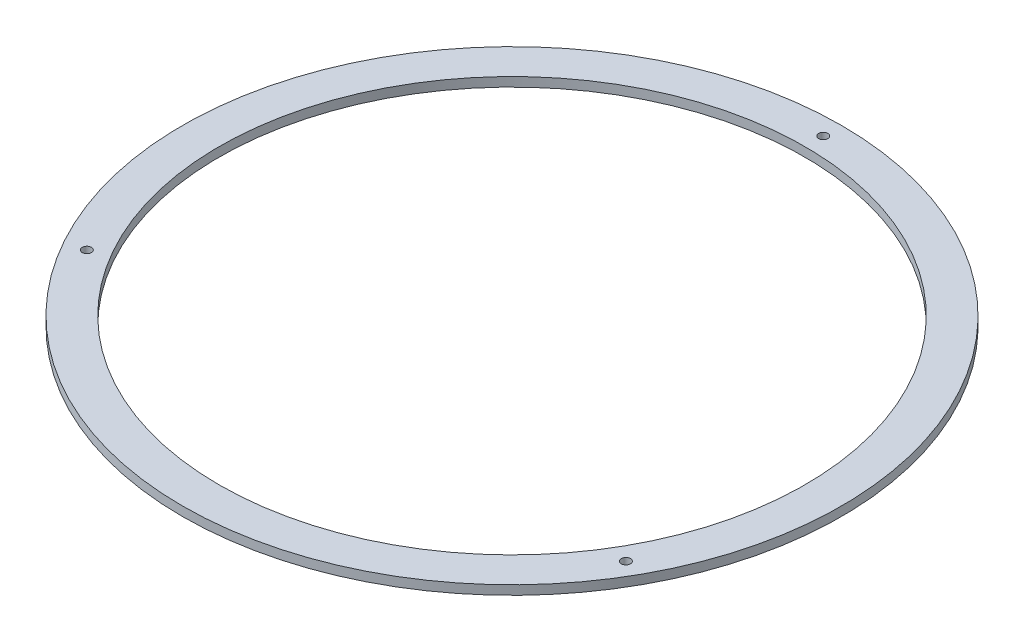
ISO-10303-21;
HEADER;
FILE_DESCRIPTION(('STEP AP214'),'2;1');
FILE_NAME('part.step','',(''),(''),'','','');
FILE_SCHEMA(('AUTOMOTIVE_DESIGN { 1 0 10303 214 1 1 1 1 }'));
ENDSEC;
DATA;
#1=APPLICATION_CONTEXT('core data for automotive mechanical design processes');
#2=APPLICATION_PROTOCOL_DEFINITION('international standard','automotive_design',2000,#1);
#3=PRODUCT_CONTEXT('',#1,'mechanical');
#4=PRODUCT('Part','Part','',(#3));
#5=PRODUCT_RELATED_PRODUCT_CATEGORY('part','',(#4));
#6=PRODUCT_DEFINITION_FORMATION('','',#4);
#7=PRODUCT_DEFINITION_CONTEXT('part definition',#1,'design');
#8=PRODUCT_DEFINITION('design','',#6,#7);
#9=PRODUCT_DEFINITION_SHAPE('','',#8);
#10=(LENGTH_UNIT() NAMED_UNIT(*) SI_UNIT(.MILLI.,.METRE.));
#11=(NAMED_UNIT(*) PLANE_ANGLE_UNIT() SI_UNIT($,.RADIAN.));
#12=(NAMED_UNIT(*) SI_UNIT($,.STERADIAN.) SOLID_ANGLE_UNIT());
#13=UNCERTAINTY_MEASURE_WITH_UNIT(LENGTH_MEASURE(1.E-05),#10,'distance_accuracy_value','');
#14=(GEOMETRIC_REPRESENTATION_CONTEXT(3) GLOBAL_UNCERTAINTY_ASSIGNED_CONTEXT((#13)) GLOBAL_UNIT_ASSIGNED_CONTEXT((#10,
#11,#12)) REPRESENTATION_CONTEXT('',''));
#15=CARTESIAN_POINT('',(0.,0.,0.));
#16=DIRECTION('',(0.,0.,1.));
#17=DIRECTION('',(1.,0.,0.));
#18=AXIS2_PLACEMENT_3D('',#15,#16,#17);
#19=CARTESIAN_POINT('',(0.,6.35,0.));
#20=DIRECTION('',(0.,-1.,0.));
#21=DIRECTION('',(0.,0.,-1.));
#22=AXIS2_PLACEMENT_3D('',#19,#20,#21);
#23=CYLINDRICAL_SURFACE('',#22,228.6);
#24=CARTESIAN_POINT('',(0.,6.35,0.));
#25=DIRECTION('',(0.,1.,0.));
#26=DIRECTION('',(0.,0.,1.));
#27=AXIS2_PLACEMENT_3D('',#24,#25,#26);
#28=CIRCLE('',#27,228.6);
#29=CARTESIAN_POINT('',(0.,6.35,228.6));
#30=VERTEX_POINT('',#29);
#31=EDGE_CURVE('E10',#30,#30,#28,.T.);
#32=ORIENTED_EDGE('',*,*,#31,.F.);
#33=EDGE_LOOP('',(#32));
#34=FACE_BOUND('',#33,.T.);
#35=CARTESIAN_POINT('',(0.,0.,0.));
#36=DIRECTION('',(0.,1.,0.));
#37=DIRECTION('',(0.,0.,1.));
#38=AXIS2_PLACEMENT_3D('',#35,#36,#37);
#39=CIRCLE('',#38,228.6);
#40=CARTESIAN_POINT('',(0.,0.,228.6));
#41=VERTEX_POINT('',#40);
#42=EDGE_CURVE('E40',#41,#41,#39,.T.);
#43=ORIENTED_EDGE('',*,*,#42,.T.);
#44=EDGE_LOOP('',(#43));
#45=FACE_BOUND('',#44,.T.);
#46=ADVANCED_FACE('F37',(#34,#45),#23,.T.);
#47=CARTESIAN_POINT('',(0.,6.35,0.));
#48=DIRECTION('',(0.,1.,0.));
#49=DIRECTION('',(0.,0.,1.));
#50=AXIS2_PLACEMENT_3D('',#47,#48,#49);
#51=PLANE('',#50);
#52=CARTESIAN_POINT('',(0.,6.35,0.));
#53=DIRECTION('',(0.,1.,0.));
#54=DIRECTION('',(0.,0.,1.));
#55=AXIS2_PLACEMENT_3D('',#52,#53,#54);
#56=CIRCLE('',#55,203.2);
#57=CARTESIAN_POINT('',(0.,6.35,203.2));
#58=VERTEX_POINT('',#57);
#59=EDGE_CURVE('E62',#58,#58,#56,.T.);
#60=ORIENTED_EDGE('',*,*,#59,.F.);
#61=EDGE_LOOP('',(#60));
#62=FACE_BOUND('',#61,.T.);
#63=CARTESIAN_POINT('',(0.,6.35,-215.9));
#64=DIRECTION('',(0.,1.,0.));
#65=DIRECTION('',(0.,0.,1.));
#66=AXIS2_PLACEMENT_3D('',#63,#64,#65);
#67=CIRCLE('',#66,3.175);
#68=CARTESIAN_POINT('',(0.,6.35,-212.725));
#69=VERTEX_POINT('',#68);
#70=EDGE_CURVE('E47',#69,#69,#67,.T.);
#71=ORIENTED_EDGE('',*,*,#70,.F.);
#72=EDGE_LOOP('',(#71));
#73=FACE_BOUND('',#72,.T.);
#74=CARTESIAN_POINT('',(-186.97488467706,6.35,107.95));
#75=DIRECTION('',(0.,1.,0.));
#76=DIRECTION('',(0.,0.,1.));
#77=AXIS2_PLACEMENT_3D('',#74,#75,#76);
#78=CIRCLE('',#77,3.175);
#79=CARTESIAN_POINT('',(-186.97488467706,6.35,111.125));
#80=VERTEX_POINT('',#79);
#81=EDGE_CURVE('E51',#80,#80,#78,.T.);
#82=ORIENTED_EDGE('',*,*,#81,.F.);
#83=EDGE_LOOP('',(#82));
#84=FACE_BOUND('',#83,.T.);
#85=CARTESIAN_POINT('',(186.97488467706,6.35,107.95));
#86=DIRECTION('',(0.,1.,0.));
#87=DIRECTION('',(0.,0.,1.));
#88=AXIS2_PLACEMENT_3D('',#85,#86,#87);
#89=CIRCLE('',#88,3.175);
#90=CARTESIAN_POINT('',(186.97488467706,6.35,111.125));
#91=VERTEX_POINT('',#90);
#92=EDGE_CURVE('E54',#91,#91,#89,.T.);
#93=ORIENTED_EDGE('',*,*,#92,.F.);
#94=EDGE_LOOP('',(#93));
#95=FACE_BOUND('',#94,.T.);
#96=ORIENTED_EDGE('',*,*,#31,.T.);
#97=EDGE_LOOP('',(#96));
#98=FACE_BOUND('',#97,.T.);
#99=ADVANCED_FACE('F89',(#62,#73,#84,#95,#98),#51,.T.);
#100=CARTESIAN_POINT('',(0.,0.,0.));
#101=DIRECTION('',(0.,1.,0.));
#102=DIRECTION('',(0.,0.,1.));
#103=AXIS2_PLACEMENT_3D('',#100,#101,#102);
#104=PLANE('',#103);
#105=CARTESIAN_POINT('',(0.,0.,0.));
#106=DIRECTION('',(0.,1.,0.));
#107=DIRECTION('',(0.,0.,1.));
#108=AXIS2_PLACEMENT_3D('',#105,#106,#107);
#109=CIRCLE('',#108,203.2);
#110=CARTESIAN_POINT('',(0.,0.,203.2));
#111=VERTEX_POINT('',#110);
#112=EDGE_CURVE('E69',#111,#111,#109,.T.);
#113=ORIENTED_EDGE('',*,*,#112,.T.);
#114=EDGE_LOOP('',(#113));
#115=FACE_BOUND('',#114,.T.);
#116=CARTESIAN_POINT('',(0.,0.,-215.9));
#117=DIRECTION('',(0.,1.,0.));
#118=DIRECTION('',(0.,0.,1.));
#119=AXIS2_PLACEMENT_3D('',#116,#117,#118);
#120=CIRCLE('',#119,3.175);
#121=CARTESIAN_POINT('',(0.,0.,-212.725));
#122=VERTEX_POINT('',#121);
#123=EDGE_CURVE('E57',#122,#122,#120,.T.);
#124=ORIENTED_EDGE('',*,*,#123,.T.);
#125=EDGE_LOOP('',(#124));
#126=FACE_BOUND('',#125,.T.);
#127=CARTESIAN_POINT('',(-186.97488467706,0.,107.95));
#128=DIRECTION('',(0.,1.,0.));
#129=DIRECTION('',(0.,0.,1.));
#130=AXIS2_PLACEMENT_3D('',#127,#128,#129);
#131=CIRCLE('',#130,3.175);
#132=CARTESIAN_POINT('',(-186.97488467706,0.,111.125));
#133=VERTEX_POINT('',#132);
#134=EDGE_CURVE('E61',#133,#133,#131,.T.);
#135=ORIENTED_EDGE('',*,*,#134,.T.);
#136=EDGE_LOOP('',(#135));
#137=FACE_BOUND('',#136,.T.);
#138=CARTESIAN_POINT('',(186.97488467706,0.,107.95));
#139=DIRECTION('',(0.,1.,0.));
#140=DIRECTION('',(0.,0.,1.));
#141=AXIS2_PLACEMENT_3D('',#138,#139,#140);
#142=CIRCLE('',#141,3.175);
#143=CARTESIAN_POINT('',(186.97488467706,0.,111.125));
#144=VERTEX_POINT('',#143);
#145=EDGE_CURVE('E58',#144,#144,#142,.T.);
#146=ORIENTED_EDGE('',*,*,#145,.T.);
#147=EDGE_LOOP('',(#146));
#148=FACE_BOUND('',#147,.T.);
#149=ORIENTED_EDGE('',*,*,#42,.F.);
#150=EDGE_LOOP('',(#149));
#151=FACE_BOUND('',#150,.T.);
#152=ADVANCED_FACE('F73',(#115,#126,#137,#148,#151),#104,.F.);
#153=CARTESIAN_POINT('',(186.97488467706,0.,107.95));
#154=DIRECTION('',(0.,1.,0.));
#155=DIRECTION('',(0.,0.,1.));
#156=AXIS2_PLACEMENT_3D('',#153,#154,#155);
#157=CYLINDRICAL_SURFACE('',#156,3.175);
#158=ORIENTED_EDGE('',*,*,#92,.T.);
#159=EDGE_LOOP('',(#158));
#160=FACE_BOUND('',#159,.T.);
#161=ORIENTED_EDGE('',*,*,#145,.F.);
#162=EDGE_LOOP('',(#161));
#163=FACE_BOUND('',#162,.T.);
#164=ADVANCED_FACE('F100',(#160,#163),#157,.F.);
#165=CARTESIAN_POINT('',(-186.97488467706,0.,107.95));
#166=DIRECTION('',(0.,1.,0.));
#167=DIRECTION('',(0.,0.,1.));
#168=AXIS2_PLACEMENT_3D('',#165,#166,#167);
#169=CYLINDRICAL_SURFACE('',#168,3.175);
#170=ORIENTED_EDGE('',*,*,#81,.T.);
#171=EDGE_LOOP('',(#170));
#172=FACE_BOUND('',#171,.T.);
#173=ORIENTED_EDGE('',*,*,#134,.F.);
#174=EDGE_LOOP('',(#173));
#175=FACE_BOUND('',#174,.T.);
#176=ADVANCED_FACE('F85',(#172,#175),#169,.F.);
#177=CARTESIAN_POINT('',(0.,0.,-215.9));
#178=DIRECTION('',(0.,1.,0.));
#179=DIRECTION('',(0.,0.,1.));
#180=AXIS2_PLACEMENT_3D('',#177,#178,#179);
#181=CYLINDRICAL_SURFACE('',#180,3.175);
#182=ORIENTED_EDGE('',*,*,#70,.T.);
#183=EDGE_LOOP('',(#182));
#184=FACE_BOUND('',#183,.T.);
#185=ORIENTED_EDGE('',*,*,#123,.F.);
#186=EDGE_LOOP('',(#185));
#187=FACE_BOUND('',#186,.T.);
#188=ADVANCED_FACE('F78',(#184,#187),#181,.F.);
#189=CARTESIAN_POINT('',(0.,0.,0.));
#190=DIRECTION('',(0.,1.,0.));
#191=DIRECTION('',(0.,0.,1.));
#192=AXIS2_PLACEMENT_3D('',#189,#190,#191);
#193=CYLINDRICAL_SURFACE('',#192,203.2);
#194=ORIENTED_EDGE('',*,*,#59,.T.);
#195=EDGE_LOOP('',(#194));
#196=FACE_BOUND('',#195,.T.);
#197=ORIENTED_EDGE('',*,*,#112,.F.);
#198=EDGE_LOOP('',(#197));
#199=FACE_BOUND('',#198,.T.);
#200=ADVANCED_FACE('F76',(#196,#199),#193,.F.);
#201=CLOSED_SHELL('',(#46,#99,#152,#164,#176,#188,#200));
#202=MANIFOLD_SOLID_BREP('B2',#201);
#203=ADVANCED_BREP_SHAPE_REPRESENTATION('',(#18,#202),#14);
#204=SHAPE_DEFINITION_REPRESENTATION(#9,#203);
ENDSEC;
END-ISO-10303-21;
